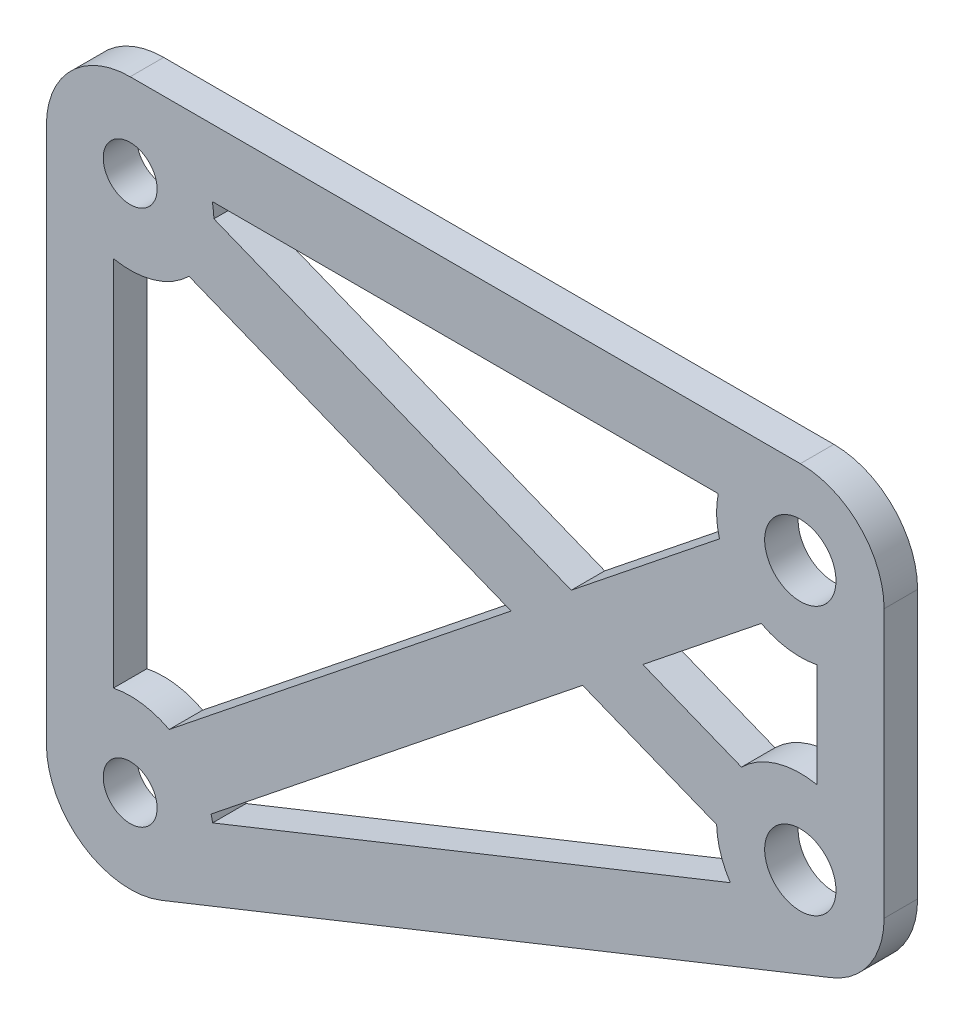
ISO-10303-21;
HEADER;
FILE_DESCRIPTION(('STEP AP214'),'2;1');
FILE_NAME('part.step','',(''),(''),'','','');
FILE_SCHEMA(('AUTOMOTIVE_DESIGN { 1 0 10303 214 1 1 1 1 }'));
ENDSEC;
DATA;
#1=APPLICATION_CONTEXT('core data for automotive mechanical design processes');
#2=APPLICATION_PROTOCOL_DEFINITION('international standard','automotive_design',2000,#1);
#3=PRODUCT_CONTEXT('',#1,'mechanical');
#4=PRODUCT('Part','Part','',(#3));
#5=PRODUCT_RELATED_PRODUCT_CATEGORY('part','',(#4));
#6=PRODUCT_DEFINITION_FORMATION('','',#4);
#7=PRODUCT_DEFINITION_CONTEXT('part definition',#1,'design');
#8=PRODUCT_DEFINITION('design','',#6,#7);
#9=PRODUCT_DEFINITION_SHAPE('','',#8);
#10=(LENGTH_UNIT() NAMED_UNIT(*) SI_UNIT(.MILLI.,.METRE.));
#11=(NAMED_UNIT(*) PLANE_ANGLE_UNIT() SI_UNIT($,.RADIAN.));
#12=(NAMED_UNIT(*) SI_UNIT($,.STERADIAN.) SOLID_ANGLE_UNIT());
#13=UNCERTAINTY_MEASURE_WITH_UNIT(LENGTH_MEASURE(1.E-05),#10,'distance_accuracy_value','');
#14=(GEOMETRIC_REPRESENTATION_CONTEXT(3) GLOBAL_UNCERTAINTY_ASSIGNED_CONTEXT((#13)) GLOBAL_UNIT_ASSIGNED_CONTEXT((#10,
#11,#12)) REPRESENTATION_CONTEXT('',''));
#15=CARTESIAN_POINT('',(0.,0.,0.));
#16=DIRECTION('',(0.,0.,1.));
#17=DIRECTION('',(1.,0.,0.));
#18=AXIS2_PLACEMENT_3D('',#15,#16,#17);
#19=CARTESIAN_POINT('',(63.5,50.8,3.175));
#20=DIRECTION('',(0.,0.,1.));
#21=DIRECTION('',(1.,0.,0.));
#22=AXIS2_PLACEMENT_3D('',#19,#20,#21);
#23=PLANE('',#22);
#24=CARTESIAN_POINT('',(0.,50.8,3.175));
#25=DIRECTION('',(0.,0.,1.));
#26=DIRECTION('',(1.,0.,0.));
#27=AXIS2_PLACEMENT_3D('',#24,#25,#26);
#28=CIRCLE('',#27,2.55269999999999);
#29=CARTESIAN_POINT('',(2.55269999999999,50.8,3.175));
#30=VERTEX_POINT('',#29);
#31=EDGE_CURVE('E462',#30,#30,#28,.T.);
#32=ORIENTED_EDGE('',*,*,#31,.F.);
#33=EDGE_LOOP('',(#32));
#34=FACE_BOUND('',#33,.T.);
#35=CARTESIAN_POINT('',(0.,0.,3.175));
#36=DIRECTION('',(0.,0.,1.));
#37=DIRECTION('',(1.,0.,0.));
#38=AXIS2_PLACEMENT_3D('',#35,#36,#37);
#39=CIRCLE('',#38,2.55269999999999);
#40=CARTESIAN_POINT('',(2.55269999999999,0.,3.175));
#41=VERTEX_POINT('',#40);
#42=EDGE_CURVE('E476',#41,#41,#39,.T.);
#43=ORIENTED_EDGE('',*,*,#42,.F.);
#44=EDGE_LOOP('',(#43));
#45=FACE_BOUND('',#44,.T.);
#46=CARTESIAN_POINT('',(63.5,50.8,3.175));
#47=DIRECTION('',(0.,0.,1.));
#48=DIRECTION('',(1.,0.,0.));
#49=AXIS2_PLACEMENT_3D('',#46,#47,#48);
#50=CIRCLE('',#49,3.3782);
#51=CARTESIAN_POINT('',(66.8782,50.8,3.175));
#52=VERTEX_POINT('',#51);
#53=EDGE_CURVE('E482',#52,#52,#50,.T.);
#54=ORIENTED_EDGE('',*,*,#53,.F.);
#55=EDGE_LOOP('',(#54));
#56=FACE_BOUND('',#55,.T.);
#57=CARTESIAN_POINT('',(63.5,25.4,3.175));
#58=DIRECTION('',(0.,0.,1.));
#59=DIRECTION('',(1.,0.,0.));
#60=AXIS2_PLACEMENT_3D('',#57,#58,#59);
#61=CIRCLE('',#60,3.3782);
#62=CARTESIAN_POINT('',(66.8782,25.4,3.175));
#63=VERTEX_POINT('',#62);
#64=EDGE_CURVE('E488',#63,#63,#61,.T.);
#65=ORIENTED_EDGE('',*,*,#64,.F.);
#66=EDGE_LOOP('',(#65));
#67=FACE_BOUND('',#66,.T.);
#68=CARTESIAN_POINT('',(63.5,50.8,3.175));
#69=DIRECTION('',(0.,0.,1.));
#70=DIRECTION('',(1.,0.,0.));
#71=AXIS2_PLACEMENT_3D('',#68,#69,#70);
#72=CIRCLE('',#71,7.9375);
#73=CARTESIAN_POINT('',(71.4375,50.8,3.175));
#74=VERTEX_POINT('',#73);
#75=CARTESIAN_POINT('',(63.5,58.7375,3.175));
#76=VERTEX_POINT('',#75);
#77=EDGE_CURVE('E495',#74,#76,#72,.T.);
#78=ORIENTED_EDGE('',*,*,#77,.T.);
#79=DIRECTION('',(-1.,0.,0.));
#80=VECTOR('',#79,1.);
#81=CARTESIAN_POINT('',(0.,58.7375,3.175));
#82=LINE('',#81,#80);
#83=CARTESIAN_POINT('',(0.,58.7375,3.175));
#84=VERTEX_POINT('',#83);
#85=EDGE_CURVE('E498',#76,#84,#82,.T.);
#86=ORIENTED_EDGE('',*,*,#85,.T.);
#87=CARTESIAN_POINT('',(0.,50.8,3.175));
#88=DIRECTION('',(0.,0.,1.));
#89=DIRECTION('',(1.,0.,0.));
#90=AXIS2_PLACEMENT_3D('',#87,#88,#89);
#91=CIRCLE('',#90,7.9375);
#92=CARTESIAN_POINT('',(-7.9375,50.8,3.175));
#93=VERTEX_POINT('',#92);
#94=EDGE_CURVE('E501',#84,#93,#91,.T.);
#95=ORIENTED_EDGE('',*,*,#94,.T.);
#96=DIRECTION('',(0.,-1.,0.));
#97=VECTOR('',#96,1.);
#98=CARTESIAN_POINT('',(-7.9375,0.,3.175));
#99=LINE('',#98,#97);
#100=CARTESIAN_POINT('',(-7.9375,0.,3.175));
#101=VERTEX_POINT('',#100);
#102=EDGE_CURVE('E503',#93,#101,#99,.T.);
#103=ORIENTED_EDGE('',*,*,#102,.T.);
#104=CARTESIAN_POINT('',(0.,0.,3.175));
#105=DIRECTION('',(0.,0.,1.));
#106=DIRECTION('',(1.,0.,0.));
#107=AXIS2_PLACEMENT_3D('',#104,#105,#106);
#108=CIRCLE('',#107,7.9375);
#109=CARTESIAN_POINT('',(2.9479134935607,-7.36978373390175,3.175));
#110=VERTEX_POINT('',#109);
#111=EDGE_CURVE('E505',#101,#110,#108,.T.);
#112=ORIENTED_EDGE('',*,*,#111,.T.);
#113=DIRECTION('',(0.928476690885259,0.371390676354104,0.));
#114=VECTOR('',#113,1.);
#115=CARTESIAN_POINT('',(66.4479134935607,18.0302162660983,3.175));
#116=LINE('',#115,#114);
#117=CARTESIAN_POINT('',(66.4479134935607,18.0302162660983,3.175));
#118=VERTEX_POINT('',#117);
#119=EDGE_CURVE('E507',#110,#118,#116,.T.);
#120=ORIENTED_EDGE('',*,*,#119,.T.);
#121=CARTESIAN_POINT('',(63.5,25.4,3.175));
#122=DIRECTION('',(0.,0.,1.));
#123=DIRECTION('',(1.,0.,0.));
#124=AXIS2_PLACEMENT_3D('',#121,#122,#123);
#125=CIRCLE('',#124,7.9375);
#126=CARTESIAN_POINT('',(71.4375,25.4,3.175));
#127=VERTEX_POINT('',#126);
#128=EDGE_CURVE('E509',#118,#127,#125,.T.);
#129=ORIENTED_EDGE('',*,*,#128,.T.);
#130=DIRECTION('',(0.,1.,0.));
#131=VECTOR('',#130,1.);
#132=CARTESIAN_POINT('',(71.4375,50.8,3.175));
#133=LINE('',#132,#131);
#134=EDGE_CURVE('E511',#127,#74,#133,.T.);
#135=ORIENTED_EDGE('',*,*,#134,.T.);
#136=EDGE_LOOP('',(#78,#86,#95,#103,#112,#120,#129,#135));
#137=FACE_BOUND('',#136,.T.);
#138=DIRECTION('',(-0.78086880944303,-0.624695047554424,0.));
#139=VECTOR('',#138,1.);
#140=CARTESIAN_POINT('',(-1.9834067759853,2.47925846998162,3.175));
#141=LINE('',#140,#139);
#142=CARTESIAN_POINT('',(36.0953637139164,32.942274861903,3.175));
#143=VERTEX_POINT('',#142);
#144=CARTESIAN_POINT('',(3.69728802704029,7.02381431240211,3.175));
#145=VERTEX_POINT('',#144);
#146=EDGE_CURVE('E449',#143,#145,#141,.T.);
#147=ORIENTED_EDGE('',*,*,#146,.T.);
#148=CARTESIAN_POINT('',(0.,0.,3.175));
#149=DIRECTION('',(0.,0.,1.));
#150=DIRECTION('',(1.,0.,0.));
#151=AXIS2_PLACEMENT_3D('',#148,#149,#150);
#152=CIRCLE('',#151,7.9375);
#153=CARTESIAN_POINT('',(-1.5875,7.77712993333659,3.175));
#154=VERTEX_POINT('',#153);
#155=EDGE_CURVE('E390',#145,#154,#152,.T.);
#156=ORIENTED_EDGE('',*,*,#155,.T.);
#157=DIRECTION('',(0.,-1.,0.));
#158=VECTOR('',#157,1.);
#159=CARTESIAN_POINT('',(-1.5875,0.,3.175));
#160=LINE('',#159,#158);
#161=CARTESIAN_POINT('',(-1.5875,43.0228700666634,3.175));
#162=VERTEX_POINT('',#161);
#163=EDGE_CURVE('E436',#162,#154,#160,.T.);
#164=ORIENTED_EDGE('',*,*,#163,.F.);
#165=CARTESIAN_POINT('',(0.,50.8,3.175));
#166=DIRECTION('',(0.,0.,1.));
#167=DIRECTION('',(1.,0.,0.));
#168=AXIS2_PLACEMENT_3D('',#165,#166,#167);
#169=CIRCLE('',#168,7.9375);
#170=CARTESIAN_POINT('',(5.57535296578753,45.1502791611546,3.175));
#171=VERTEX_POINT('',#170);
#172=EDGE_CURVE('E455',#162,#171,#169,.T.);
#173=ORIENTED_EDGE('',*,*,#172,.T.);
#174=DIRECTION('',(0.928476690885259,-0.371390676354104,0.));
#175=VECTOR('',#174,1.);
#176=CARTESIAN_POINT('',(16.3380759818861,40.8451899547152,3.175));
#177=LINE('',#176,#175);
#178=EDGE_CURVE('E452',#171,#143,#177,.T.);
#179=ORIENTED_EDGE('',*,*,#178,.T.);
#180=EDGE_LOOP('',(#147,#156,#164,#173,#179));
#181=FACE_BOUND('',#180,.T.);
#182=DIRECTION('',(0.,1.,0.));
#183=VECTOR('',#182,1.);
#184=CARTESIAN_POINT('',(65.0875,0.,3.175));
#185=LINE('',#184,#183);
#186=CARTESIAN_POINT('',(65.0875,33.1771299333366,3.175));
#187=VERTEX_POINT('',#186);
#188=CARTESIAN_POINT('',(65.0875,43.0228700666634,3.175));
#189=VERTEX_POINT('',#188);
#190=EDGE_CURVE('E346',#187,#189,#185,.T.);
#191=ORIENTED_EDGE('',*,*,#190,.F.);
#192=CARTESIAN_POINT('',(63.5,25.4,3.175));
#193=DIRECTION('',(0.,0.,1.));
#194=DIRECTION('',(1.,0.,0.));
#195=AXIS2_PLACEMENT_3D('',#192,#193,#194);
#196=CIRCLE('',#195,7.93749999999999);
#197=CARTESIAN_POINT('',(57.9246470342125,31.0497208388454,3.175));
#198=VERTEX_POINT('',#197);
#199=EDGE_CURVE('E315',#187,#198,#196,.T.);
#200=ORIENTED_EDGE('',*,*,#199,.T.);
#201=DIRECTION('',(0.928476690885259,-0.371390676354104,0.));
#202=VECTOR('',#201,1.);
#203=CARTESIAN_POINT('',(18.6964067767346,46.7410169418366,3.175));
#204=LINE('',#203,#202);
#205=CARTESIAN_POINT('',(48.5713029527502,34.7910584714303,3.175));
#206=VERTEX_POINT('',#205);
#207=EDGE_CURVE('E335',#206,#198,#204,.T.);
#208=ORIENTED_EDGE('',*,*,#207,.F.);
#209=DIRECTION('',(-0.78086880944303,-0.624695047554424,0.));
#210=VECTOR('',#209,1.);
#211=CARTESIAN_POINT('',(1.98340677598529,-2.47925846998161,3.175));
#212=LINE('',#211,#210);
#213=CARTESIAN_POINT('',(59.8027119729597,43.7761856875979,3.175));
#214=VERTEX_POINT('',#213);
#215=EDGE_CURVE('E338',#214,#206,#212,.T.);
#216=ORIENTED_EDGE('',*,*,#215,.F.);
#217=CARTESIAN_POINT('',(63.5,50.8,3.175));
#218=DIRECTION('',(0.,0.,1.));
#219=DIRECTION('',(1.,0.,0.));
#220=AXIS2_PLACEMENT_3D('',#217,#218,#219);
#221=CIRCLE('',#220,7.93749999999999);
#222=EDGE_CURVE('E349',#214,#189,#221,.T.);
#223=ORIENTED_EDGE('',*,*,#222,.T.);
#224=EDGE_LOOP('',(#191,#200,#208,#216,#223));
#225=FACE_BOUND('',#224,.T.);
#226=DIRECTION('',(-1.,0.,0.));
#227=VECTOR('',#226,1.);
#228=CARTESIAN_POINT('',(0.,52.3875,3.175));
#229=LINE('',#228,#227);
#230=CARTESIAN_POINT('',(55.7228700666634,52.3875,3.175));
#231=VERTEX_POINT('',#230);
#232=CARTESIAN_POINT('',(7.77712993333659,52.3875,3.175));
#233=VERTEX_POINT('',#232);
#234=EDGE_CURVE('E377',#231,#233,#229,.T.);
#235=ORIENTED_EDGE('',*,*,#234,.F.);
#236=CARTESIAN_POINT('',(63.5,50.8,3.175));
#237=DIRECTION('',(0.,0.,1.));
#238=DIRECTION('',(1.,0.,0.));
#239=AXIS2_PLACEMENT_3D('',#236,#237,#238);
#240=CIRCLE('',#239,7.93749999999999);
#241=CARTESIAN_POINT('',(55.8358984209891,48.7347026275612,3.175));
#242=VERTEX_POINT('',#241);
#243=EDGE_CURVE('E146',#231,#242,#240,.T.);
#244=ORIENTED_EDGE('',*,*,#243,.T.);
#245=DIRECTION('',(-0.78086880944303,-0.624695047554424,0.));
#246=VECTOR('',#245,1.);
#247=CARTESIAN_POINT('',(-1.9834067759853,2.47925846998162,3.175));
#248=LINE('',#247,#246);
#249=CARTESIAN_POINT('',(41.7946631348005,37.5017143986102,3.175));
#250=VERTEX_POINT('',#249);
#251=EDGE_CURVE('E364',#242,#250,#248,.T.);
#252=ORIENTED_EDGE('',*,*,#251,.T.);
#253=DIRECTION('',(0.928476690885259,-0.371390676354104,0.));
#254=VECTOR('',#253,1.);
#255=CARTESIAN_POINT('',(18.6964067767346,46.7410169418366,3.175));
#256=LINE('',#255,#254);
#257=CARTESIAN_POINT('',(7.93368376063609,51.046106148276,3.175));
#258=VERTEX_POINT('',#257);
#259=EDGE_CURVE('E383',#258,#250,#256,.T.);
#260=ORIENTED_EDGE('',*,*,#259,.F.);
#261=CARTESIAN_POINT('',(0.,50.8,3.175));
#262=DIRECTION('',(0.,0.,1.));
#263=DIRECTION('',(1.,0.,0.));
#264=AXIS2_PLACEMENT_3D('',#261,#262,#263);
#265=CIRCLE('',#264,7.9375);
#266=EDGE_CURVE('E380',#258,#233,#265,.T.);
#267=ORIENTED_EDGE('',*,*,#266,.T.);
#268=EDGE_LOOP('',(#235,#244,#252,#260,#267));
#269=FACE_BOUND('',#268,.T.);
#270=DIRECTION('',(0.928476690885259,0.371390676354104,0.));
#271=VECTOR('',#270,1.);
#272=CARTESIAN_POINT('',(0.589582698712141,-1.47395674678035,3.175));
#273=LINE('',#272,#271);
#274=CARTESIAN_POINT('',(7.8104665638012,1.41439679925528,3.175));
#275=VERTEX_POINT('',#274);
#276=CARTESIAN_POINT('',(56.8686988336231,21.037689707184,3.175));
#277=VERTEX_POINT('',#276);
#278=EDGE_CURVE('E414',#275,#277,#273,.T.);
#279=ORIENTED_EDGE('',*,*,#278,.F.);
#280=CARTESIAN_POINT('',(0.,0.,3.175));
#281=DIRECTION('',(0.,0.,1.));
#282=DIRECTION('',(1.,0.,0.));
#283=AXIS2_PLACEMENT_3D('',#280,#281,#282);
#284=CIRCLE('',#283,7.9375);
#285=CARTESIAN_POINT('',(7.66410157901089,2.06529737243886,3.175));
#286=VERTEX_POINT('',#285);
#287=EDGE_CURVE('E138',#275,#286,#284,.T.);
#288=ORIENTED_EDGE('',*,*,#287,.T.);
#289=DIRECTION('',(-0.78086880944303,-0.624695047554424,0.));
#290=VECTOR('',#289,1.);
#291=CARTESIAN_POINT('',(1.98340677598529,-2.47925846998161,3.175));
#292=LINE('',#291,#290);
#293=CARTESIAN_POINT('',(42.8720035318662,30.2316189347231,3.175));
#294=VERTEX_POINT('',#293);
#295=EDGE_CURVE('E401',#294,#286,#292,.T.);
#296=ORIENTED_EDGE('',*,*,#295,.F.);
#297=DIRECTION('',(0.928476690885259,-0.371390676354104,0.));
#298=VECTOR('',#297,1.);
#299=CARTESIAN_POINT('',(16.3380759818861,40.8451899547152,3.175));
#300=LINE('',#299,#298);
#301=CARTESIAN_POINT('',(55.5663162393639,25.153893851724,3.175));
#302=VERTEX_POINT('',#301);
#303=EDGE_CURVE('E420',#294,#302,#300,.T.);
#304=ORIENTED_EDGE('',*,*,#303,.T.);
#305=CARTESIAN_POINT('',(63.5,25.4,3.175));
#306=DIRECTION('',(0.,0.,1.));
#307=DIRECTION('',(1.,0.,0.));
#308=AXIS2_PLACEMENT_3D('',#305,#306,#307);
#309=CIRCLE('',#308,7.93749999999999);
#310=EDGE_CURVE('E417',#302,#277,#309,.T.);
#311=ORIENTED_EDGE('',*,*,#310,.T.);
#312=EDGE_LOOP('',(#279,#288,#296,#304,#311));
#313=FACE_BOUND('',#312,.T.);
#314=ADVANCED_FACE('F123',(#34,#45,#56,#67,#137,#181,#225,#269,#313),#23,.T.);
#315=CARTESIAN_POINT('',(63.5,50.8,0.));
#316=DIRECTION('',(0.,0.,1.));
#317=DIRECTION('',(1.,0.,0.));
#318=AXIS2_PLACEMENT_3D('',#315,#316,#317);
#319=PLANE('',#318);
#320=CARTESIAN_POINT('',(63.5,50.8,0.));
#321=DIRECTION('',(0.,0.,1.));
#322=DIRECTION('',(1.,0.,0.));
#323=AXIS2_PLACEMENT_3D('',#320,#321,#322);
#324=CIRCLE('',#323,7.93749999999999);
#325=CARTESIAN_POINT('',(55.7228700666634,52.3875,0.));
#326=VERTEX_POINT('',#325);
#327=CARTESIAN_POINT('',(55.8358984209891,48.7347026275612,0.));
#328=VERTEX_POINT('',#327);
#329=EDGE_CURVE('E361',#326,#328,#324,.T.);
#330=ORIENTED_EDGE('',*,*,#329,.F.);
#331=DIRECTION('',(-1.,0.,0.));
#332=VECTOR('',#331,1.);
#333=CARTESIAN_POINT('',(0.,52.3875,0.));
#334=LINE('',#333,#332);
#335=CARTESIAN_POINT('',(7.77712993333659,52.3875,0.));
#336=VERTEX_POINT('',#335);
#337=EDGE_CURVE('E363',#326,#336,#334,.T.);
#338=ORIENTED_EDGE('',*,*,#337,.T.);
#339=CARTESIAN_POINT('',(0.,50.8,0.));
#340=DIRECTION('',(0.,0.,1.));
#341=DIRECTION('',(1.,0.,0.));
#342=AXIS2_PLACEMENT_3D('',#339,#340,#341);
#343=CIRCLE('',#342,7.9375);
#344=CARTESIAN_POINT('',(7.93368376063609,51.046106148276,0.));
#345=VERTEX_POINT('',#344);
#346=EDGE_CURVE('E367',#345,#336,#343,.T.);
#347=ORIENTED_EDGE('',*,*,#346,.F.);
#348=DIRECTION('',(0.928476690885259,-0.371390676354104,0.));
#349=VECTOR('',#348,1.);
#350=CARTESIAN_POINT('',(18.6964067767346,46.7410169418366,0.));
#351=LINE('',#350,#349);
#352=CARTESIAN_POINT('',(41.7946631348005,37.5017143986102,0.));
#353=VERTEX_POINT('',#352);
#354=EDGE_CURVE('E370',#345,#353,#351,.T.);
#355=ORIENTED_EDGE('',*,*,#354,.T.);
#356=DIRECTION('',(-0.78086880944303,-0.624695047554424,0.));
#357=VECTOR('',#356,1.);
#358=CARTESIAN_POINT('',(-1.9834067759853,2.47925846998162,0.));
#359=LINE('',#358,#357);
#360=EDGE_CURVE('E373',#328,#353,#359,.T.);
#361=ORIENTED_EDGE('',*,*,#360,.F.);
#362=EDGE_LOOP('',(#330,#338,#347,#355,#361));
#363=FACE_BOUND('',#362,.T.);
#364=CARTESIAN_POINT('',(0.,0.,0.));
#365=DIRECTION('',(0.,0.,1.));
#366=DIRECTION('',(1.,0.,0.));
#367=AXIS2_PLACEMENT_3D('',#364,#365,#366);
#368=CIRCLE('',#367,7.9375);
#369=CARTESIAN_POINT('',(3.69728802704029,7.0238143124021,0.));
#370=VERTEX_POINT('',#369);
#371=CARTESIAN_POINT('',(-1.5875,7.77712993333659,0.));
#372=VERTEX_POINT('',#371);
#373=EDGE_CURVE('E433',#370,#372,#368,.T.);
#374=ORIENTED_EDGE('',*,*,#373,.F.);
#375=DIRECTION('',(-0.78086880944303,-0.624695047554424,0.));
#376=VECTOR('',#375,1.);
#377=CARTESIAN_POINT('',(-1.9834067759853,2.47925846998162,0.));
#378=LINE('',#377,#376);
#379=CARTESIAN_POINT('',(36.0953637139164,32.942274861903,0.));
#380=VERTEX_POINT('',#379);
#381=EDGE_CURVE('E435',#380,#370,#378,.T.);
#382=ORIENTED_EDGE('',*,*,#381,.F.);
#383=DIRECTION('',(0.928476690885259,-0.371390676354104,0.));
#384=VECTOR('',#383,1.);
#385=CARTESIAN_POINT('',(16.3380759818861,40.8451899547152,0.));
#386=LINE('',#385,#384);
#387=CARTESIAN_POINT('',(5.57535296578753,45.1502791611546,0.));
#388=VERTEX_POINT('',#387);
#389=EDGE_CURVE('E438',#388,#380,#386,.T.);
#390=ORIENTED_EDGE('',*,*,#389,.F.);
#391=CARTESIAN_POINT('',(0.,50.8,0.));
#392=DIRECTION('',(0.,0.,1.));
#393=DIRECTION('',(1.,0.,0.));
#394=AXIS2_PLACEMENT_3D('',#391,#392,#393);
#395=CIRCLE('',#394,7.9375);
#396=CARTESIAN_POINT('',(-1.5875,43.0228700666634,0.));
#397=VERTEX_POINT('',#396);
#398=EDGE_CURVE('E441',#397,#388,#395,.T.);
#399=ORIENTED_EDGE('',*,*,#398,.F.);
#400=DIRECTION('',(0.,-1.,0.));
#401=VECTOR('',#400,1.);
#402=CARTESIAN_POINT('',(-1.5875,0.,0.));
#403=LINE('',#402,#401);
#404=EDGE_CURVE('E443',#397,#372,#403,.T.);
#405=ORIENTED_EDGE('',*,*,#404,.T.);
#406=EDGE_LOOP('',(#374,#382,#390,#399,#405));
#407=FACE_BOUND('',#406,.T.);
#408=CARTESIAN_POINT('',(0.,50.8,0.));
#409=DIRECTION('',(0.,0.,1.));
#410=DIRECTION('',(1.,0.,0.));
#411=AXIS2_PLACEMENT_3D('',#408,#409,#410);
#412=CIRCLE('',#411,2.55269999999999);
#413=CARTESIAN_POINT('',(2.55269999999999,50.8,0.));
#414=VERTEX_POINT('',#413);
#415=EDGE_CURVE('E473',#414,#414,#412,.T.);
#416=ORIENTED_EDGE('',*,*,#415,.T.);
#417=EDGE_LOOP('',(#416));
#418=FACE_BOUND('',#417,.T.);
#419=CARTESIAN_POINT('',(0.,0.,0.));
#420=DIRECTION('',(0.,0.,1.));
#421=DIRECTION('',(1.,0.,0.));
#422=AXIS2_PLACEMENT_3D('',#419,#420,#421);
#423=CIRCLE('',#422,2.55269999999999);
#424=CARTESIAN_POINT('',(2.55269999999999,0.,0.));
#425=VERTEX_POINT('',#424);
#426=EDGE_CURVE('E479',#425,#425,#423,.T.);
#427=ORIENTED_EDGE('',*,*,#426,.T.);
#428=EDGE_LOOP('',(#427));
#429=FACE_BOUND('',#428,.T.);
#430=CARTESIAN_POINT('',(63.5,50.8,0.));
#431=DIRECTION('',(0.,0.,1.));
#432=DIRECTION('',(1.,0.,0.));
#433=AXIS2_PLACEMENT_3D('',#430,#431,#432);
#434=CIRCLE('',#433,3.3782);
#435=CARTESIAN_POINT('',(66.8782,50.8,0.));
#436=VERTEX_POINT('',#435);
#437=EDGE_CURVE('E485',#436,#436,#434,.T.);
#438=ORIENTED_EDGE('',*,*,#437,.T.);
#439=EDGE_LOOP('',(#438));
#440=FACE_BOUND('',#439,.T.);
#441=CARTESIAN_POINT('',(63.5,25.4,0.));
#442=DIRECTION('',(0.,0.,1.));
#443=DIRECTION('',(1.,0.,0.));
#444=AXIS2_PLACEMENT_3D('',#441,#442,#443);
#445=CIRCLE('',#444,3.3782);
#446=CARTESIAN_POINT('',(66.8782,25.4,0.));
#447=VERTEX_POINT('',#446);
#448=EDGE_CURVE('E491',#447,#447,#445,.T.);
#449=ORIENTED_EDGE('',*,*,#448,.T.);
#450=EDGE_LOOP('',(#449));
#451=FACE_BOUND('',#450,.T.);
#452=CARTESIAN_POINT('',(63.5,50.8,0.));
#453=DIRECTION('',(0.,0.,1.));
#454=DIRECTION('',(1.,0.,0.));
#455=AXIS2_PLACEMENT_3D('',#452,#453,#454);
#456=CIRCLE('',#455,7.9375);
#457=CARTESIAN_POINT('',(71.4375,50.8,0.));
#458=VERTEX_POINT('',#457);
#459=CARTESIAN_POINT('',(63.5,58.7375,0.));
#460=VERTEX_POINT('',#459);
#461=EDGE_CURVE('E494',#458,#460,#456,.T.);
#462=ORIENTED_EDGE('',*,*,#461,.F.);
#463=DIRECTION('',(0.,1.,0.));
#464=VECTOR('',#463,1.);
#465=CARTESIAN_POINT('',(71.4375,50.8,0.));
#466=LINE('',#465,#464);
#467=CARTESIAN_POINT('',(71.4375,25.4,0.));
#468=VERTEX_POINT('',#467);
#469=EDGE_CURVE('E499',#468,#458,#466,.T.);
#470=ORIENTED_EDGE('',*,*,#469,.F.);
#471=CARTESIAN_POINT('',(63.5,25.4,0.));
#472=DIRECTION('',(0.,0.,1.));
#473=DIRECTION('',(1.,0.,0.));
#474=AXIS2_PLACEMENT_3D('',#471,#472,#473);
#475=CIRCLE('',#474,7.9375);
#476=CARTESIAN_POINT('',(66.4479134935607,18.0302162660983,0.));
#477=VERTEX_POINT('',#476);
#478=EDGE_CURVE('E526',#477,#468,#475,.T.);
#479=ORIENTED_EDGE('',*,*,#478,.F.);
#480=DIRECTION('',(0.928476690885259,0.371390676354104,0.));
#481=VECTOR('',#480,1.);
#482=CARTESIAN_POINT('',(66.4479134935607,18.0302162660983,0.));
#483=LINE('',#482,#481);
#484=CARTESIAN_POINT('',(2.9479134935607,-7.36978373390175,0.));
#485=VERTEX_POINT('',#484);
#486=EDGE_CURVE('E524',#485,#477,#483,.T.);
#487=ORIENTED_EDGE('',*,*,#486,.F.);
#488=CARTESIAN_POINT('',(0.,0.,0.));
#489=DIRECTION('',(0.,0.,1.));
#490=DIRECTION('',(1.,0.,0.));
#491=AXIS2_PLACEMENT_3D('',#488,#489,#490);
#492=CIRCLE('',#491,7.9375);
#493=CARTESIAN_POINT('',(-7.9375,0.,0.));
#494=VERTEX_POINT('',#493);
#495=EDGE_CURVE('E522',#494,#485,#492,.T.);
#496=ORIENTED_EDGE('',*,*,#495,.F.);
#497=DIRECTION('',(0.,-1.,0.));
#498=VECTOR('',#497,1.);
#499=CARTESIAN_POINT('',(-7.9375,0.,0.));
#500=LINE('',#499,#498);
#501=CARTESIAN_POINT('',(-7.9375,50.8,0.));
#502=VERTEX_POINT('',#501);
#503=EDGE_CURVE('E520',#502,#494,#500,.T.);
#504=ORIENTED_EDGE('',*,*,#503,.F.);
#505=CARTESIAN_POINT('',(0.,50.8,0.));
#506=DIRECTION('',(0.,0.,1.));
#507=DIRECTION('',(1.,0.,0.));
#508=AXIS2_PLACEMENT_3D('',#505,#506,#507);
#509=CIRCLE('',#508,7.9375);
#510=CARTESIAN_POINT('',(0.,58.7375,0.));
#511=VERTEX_POINT('',#510);
#512=EDGE_CURVE('E518',#511,#502,#509,.T.);
#513=ORIENTED_EDGE('',*,*,#512,.F.);
#514=DIRECTION('',(-1.,0.,0.));
#515=VECTOR('',#514,1.);
#516=CARTESIAN_POINT('',(0.,58.7375,0.));
#517=LINE('',#516,#515);
#518=EDGE_CURVE('E516',#460,#511,#517,.T.);
#519=ORIENTED_EDGE('',*,*,#518,.F.);
#520=EDGE_LOOP('',(#462,#470,#479,#487,#496,#504,#513,#519));
#521=FACE_BOUND('',#520,.T.);
#522=CARTESIAN_POINT('',(63.5,25.4,0.));
#523=DIRECTION('',(0.,0.,1.));
#524=DIRECTION('',(1.,0.,0.));
#525=AXIS2_PLACEMENT_3D('',#522,#523,#524);
#526=CIRCLE('',#525,7.93749999999999);
#527=CARTESIAN_POINT('',(65.0875,33.1771299333366,0.));
#528=VERTEX_POINT('',#527);
#529=CARTESIAN_POINT('',(57.9246470342125,31.0497208388454,0.));
#530=VERTEX_POINT('',#529);
#531=EDGE_CURVE('E312',#528,#530,#526,.T.);
#532=ORIENTED_EDGE('',*,*,#531,.F.);
#533=DIRECTION('',(0.,1.,0.));
#534=VECTOR('',#533,1.);
#535=CARTESIAN_POINT('',(65.0875,0.,0.));
#536=LINE('',#535,#534);
#537=CARTESIAN_POINT('',(65.0875,43.0228700666634,0.));
#538=VERTEX_POINT('',#537);
#539=EDGE_CURVE('E323',#528,#538,#536,.T.);
#540=ORIENTED_EDGE('',*,*,#539,.T.);
#541=CARTESIAN_POINT('',(63.5,50.8,0.));
#542=DIRECTION('',(0.,0.,1.));
#543=DIRECTION('',(1.,0.,0.));
#544=AXIS2_PLACEMENT_3D('',#541,#542,#543);
#545=CIRCLE('',#544,7.93749999999999);
#546=CARTESIAN_POINT('',(59.8027119729597,43.7761856875979,0.));
#547=VERTEX_POINT('',#546);
#548=EDGE_CURVE('E328',#547,#538,#545,.T.);
#549=ORIENTED_EDGE('',*,*,#548,.F.);
#550=DIRECTION('',(-0.78086880944303,-0.624695047554424,0.));
#551=VECTOR('',#550,1.);
#552=CARTESIAN_POINT('',(1.98340677598529,-2.47925846998161,0.));
#553=LINE('',#552,#551);
#554=CARTESIAN_POINT('',(48.5713029527502,34.7910584714303,0.));
#555=VERTEX_POINT('',#554);
#556=EDGE_CURVE('E342',#547,#555,#553,.T.);
#557=ORIENTED_EDGE('',*,*,#556,.T.);
#558=DIRECTION('',(0.928476690885259,-0.371390676354104,0.));
#559=VECTOR('',#558,1.);
#560=CARTESIAN_POINT('',(18.6964067767346,46.7410169418366,0.));
#561=LINE('',#560,#559);
#562=EDGE_CURVE('E320',#555,#530,#561,.T.);
#563=ORIENTED_EDGE('',*,*,#562,.T.);
#564=EDGE_LOOP('',(#532,#540,#549,#557,#563));
#565=FACE_BOUND('',#564,.T.);
#566=CARTESIAN_POINT('',(0.,0.,0.));
#567=DIRECTION('',(0.,0.,1.));
#568=DIRECTION('',(1.,0.,0.));
#569=AXIS2_PLACEMENT_3D('',#566,#567,#568);
#570=CIRCLE('',#569,7.9375);
#571=CARTESIAN_POINT('',(7.8104665638012,1.41439679925527,0.));
#572=VERTEX_POINT('',#571);
#573=CARTESIAN_POINT('',(7.66410157901089,2.06529737243886,0.));
#574=VERTEX_POINT('',#573);
#575=EDGE_CURVE('E398',#572,#574,#570,.T.);
#576=ORIENTED_EDGE('',*,*,#575,.F.);
#577=DIRECTION('',(0.928476690885259,0.371390676354104,0.));
#578=VECTOR('',#577,1.);
#579=CARTESIAN_POINT('',(0.589582698712141,-1.47395674678035,0.));
#580=LINE('',#579,#578);
#581=CARTESIAN_POINT('',(56.8686988336231,21.037689707184,0.));
#582=VERTEX_POINT('',#581);
#583=EDGE_CURVE('E400',#572,#582,#580,.T.);
#584=ORIENTED_EDGE('',*,*,#583,.T.);
#585=CARTESIAN_POINT('',(63.5,25.4,0.));
#586=DIRECTION('',(0.,0.,1.));
#587=DIRECTION('',(1.,0.,0.));
#588=AXIS2_PLACEMENT_3D('',#585,#586,#587);
#589=CIRCLE('',#588,7.93749999999999);
#590=CARTESIAN_POINT('',(55.5663162393639,25.153893851724,0.));
#591=VERTEX_POINT('',#590);
#592=EDGE_CURVE('E404',#591,#582,#589,.T.);
#593=ORIENTED_EDGE('',*,*,#592,.F.);
#594=DIRECTION('',(0.928476690885259,-0.371390676354104,0.));
#595=VECTOR('',#594,1.);
#596=CARTESIAN_POINT('',(16.3380759818861,40.8451899547152,0.));
#597=LINE('',#596,#595);
#598=CARTESIAN_POINT('',(42.8720035318662,30.2316189347231,0.));
#599=VERTEX_POINT('',#598);
#600=EDGE_CURVE('E407',#599,#591,#597,.T.);
#601=ORIENTED_EDGE('',*,*,#600,.F.);
#602=DIRECTION('',(-0.78086880944303,-0.624695047554424,0.));
#603=VECTOR('',#602,1.);
#604=CARTESIAN_POINT('',(1.98340677598529,-2.47925846998161,0.));
#605=LINE('',#604,#603);
#606=EDGE_CURVE('E409',#599,#574,#605,.T.);
#607=ORIENTED_EDGE('',*,*,#606,.T.);
#608=EDGE_LOOP('',(#576,#584,#593,#601,#607));
#609=FACE_BOUND('',#608,.T.);
#610=ADVANCED_FACE('F331',(#363,#407,#418,#429,#440,#451,#521,#565,#609),#319,.F.);
#611=CARTESIAN_POINT('',(63.5,50.8,3.175));
#612=DIRECTION('',(0.,0.,-1.));
#613=DIRECTION('',(-1.,0.,0.));
#614=AXIS2_PLACEMENT_3D('',#611,#612,#613);
#615=CYLINDRICAL_SURFACE('',#614,7.9375);
#616=ORIENTED_EDGE('',*,*,#461,.T.);
#617=DIRECTION('',(0.,0.,-1.));
#618=VECTOR('',#617,1.);
#619=CARTESIAN_POINT('',(63.5,58.7375,3.175));
#620=LINE('',#619,#618);
#621=EDGE_CURVE('E12',#76,#460,#620,.T.);
#622=ORIENTED_EDGE('',*,*,#621,.F.);
#623=ORIENTED_EDGE('',*,*,#77,.F.);
#624=DIRECTION('',(0.,0.,-1.));
#625=VECTOR('',#624,1.);
#626=CARTESIAN_POINT('',(71.4375,50.8,3.175));
#627=LINE('',#626,#625);
#628=EDGE_CURVE('E513',#74,#458,#627,.T.);
#629=ORIENTED_EDGE('',*,*,#628,.T.);
#630=EDGE_LOOP('',(#616,#622,#623,#629));
#631=FACE_BOUND('',#630,.T.);
#632=ADVANCED_FACE('F125',(#631),#615,.T.);
#633=CARTESIAN_POINT('',(0.,58.7375,3.175));
#634=DIRECTION('',(0.,-1.,0.));
#635=DIRECTION('',(0.,0.,-1.));
#636=AXIS2_PLACEMENT_3D('',#633,#634,#635);
#637=PLANE('',#636);
#638=ORIENTED_EDGE('',*,*,#518,.T.);
#639=DIRECTION('',(0.,0.,-1.));
#640=VECTOR('',#639,1.);
#641=CARTESIAN_POINT('',(0.,58.7375,3.175));
#642=LINE('',#641,#640);
#643=EDGE_CURVE('E131',#84,#511,#642,.T.);
#644=ORIENTED_EDGE('',*,*,#643,.F.);
#645=ORIENTED_EDGE('',*,*,#85,.F.);
#646=ORIENTED_EDGE('',*,*,#621,.T.);
#647=EDGE_LOOP('',(#638,#644,#645,#646));
#648=FACE_BOUND('',#647,.T.);
#649=ADVANCED_FACE('F572',(#648),#637,.F.);
#650=CARTESIAN_POINT('',(0.,50.8,3.175));
#651=DIRECTION('',(0.,0.,-1.));
#652=DIRECTION('',(-1.,0.,0.));
#653=AXIS2_PLACEMENT_3D('',#650,#651,#652);
#654=CYLINDRICAL_SURFACE('',#653,7.9375);
#655=ORIENTED_EDGE('',*,*,#512,.T.);
#656=DIRECTION('',(0.,0.,-1.));
#657=VECTOR('',#656,1.);
#658=CARTESIAN_POINT('',(-7.9375,50.8,3.175));
#659=LINE('',#658,#657);
#660=EDGE_CURVE('E543',#93,#502,#659,.T.);
#661=ORIENTED_EDGE('',*,*,#660,.F.);
#662=ORIENTED_EDGE('',*,*,#94,.F.);
#663=ORIENTED_EDGE('',*,*,#643,.T.);
#664=EDGE_LOOP('',(#655,#661,#662,#663));
#665=FACE_BOUND('',#664,.T.);
#666=ADVANCED_FACE('F550',(#665),#654,.T.);
#667=CARTESIAN_POINT('',(-7.9375,0.,3.175));
#668=DIRECTION('',(1.,0.,0.));
#669=DIRECTION('',(0.,0.,-1.));
#670=AXIS2_PLACEMENT_3D('',#667,#668,#669);
#671=PLANE('',#670);
#672=ORIENTED_EDGE('',*,*,#503,.T.);
#673=DIRECTION('',(0.,0.,-1.));
#674=VECTOR('',#673,1.);
#675=CARTESIAN_POINT('',(-7.9375,0.,3.175));
#676=LINE('',#675,#674);
#677=EDGE_CURVE('E540',#101,#494,#676,.T.);
#678=ORIENTED_EDGE('',*,*,#677,.F.);
#679=ORIENTED_EDGE('',*,*,#102,.F.);
#680=ORIENTED_EDGE('',*,*,#660,.T.);
#681=EDGE_LOOP('',(#672,#678,#679,#680));
#682=FACE_BOUND('',#681,.T.);
#683=ADVANCED_FACE('F560',(#682),#671,.F.);
#684=CARTESIAN_POINT('',(0.,0.,3.175));
#685=DIRECTION('',(0.,0.,-1.));
#686=DIRECTION('',(-1.,0.,0.));
#687=AXIS2_PLACEMENT_3D('',#684,#685,#686);
#688=CYLINDRICAL_SURFACE('',#687,7.9375);
#689=ORIENTED_EDGE('',*,*,#495,.T.);
#690=DIRECTION('',(0.,0.,-1.));
#691=VECTOR('',#690,1.);
#692=CARTESIAN_POINT('',(2.9479134935607,-7.36978373390175,3.175));
#693=LINE('',#692,#691);
#694=EDGE_CURVE('E537',#110,#485,#693,.T.);
#695=ORIENTED_EDGE('',*,*,#694,.F.);
#696=ORIENTED_EDGE('',*,*,#111,.F.);
#697=ORIENTED_EDGE('',*,*,#677,.T.);
#698=EDGE_LOOP('',(#689,#695,#696,#697));
#699=FACE_BOUND('',#698,.T.);
#700=ADVANCED_FACE('F564',(#699),#688,.T.);
#701=CARTESIAN_POINT('',(66.4479134935607,18.0302162660983,3.175));
#702=DIRECTION('',(-0.371390676354104,0.928476690885259,0.));
#703=DIRECTION('',(-0.928476690885259,-0.371390676354104,0.));
#704=AXIS2_PLACEMENT_3D('',#701,#702,#703);
#705=PLANE('',#704);
#706=ORIENTED_EDGE('',*,*,#486,.T.);
#707=DIRECTION('',(0.,0.,-1.));
#708=VECTOR('',#707,1.);
#709=CARTESIAN_POINT('',(66.4479134935607,18.0302162660983,3.175));
#710=LINE('',#709,#708);
#711=EDGE_CURVE('E534',#118,#477,#710,.T.);
#712=ORIENTED_EDGE('',*,*,#711,.F.);
#713=ORIENTED_EDGE('',*,*,#119,.F.);
#714=ORIENTED_EDGE('',*,*,#694,.T.);
#715=EDGE_LOOP('',(#706,#712,#713,#714));
#716=FACE_BOUND('',#715,.T.);
#717=ADVANCED_FACE('F585',(#716),#705,.F.);
#718=CARTESIAN_POINT('',(63.5,25.4,3.175));
#719=DIRECTION('',(0.,0.,-1.));
#720=DIRECTION('',(-1.,0.,0.));
#721=AXIS2_PLACEMENT_3D('',#718,#719,#720);
#722=CYLINDRICAL_SURFACE('',#721,7.9375);
#723=ORIENTED_EDGE('',*,*,#478,.T.);
#724=DIRECTION('',(0.,0.,-1.));
#725=VECTOR('',#724,1.);
#726=CARTESIAN_POINT('',(71.4375,25.4,3.175));
#727=LINE('',#726,#725);
#728=EDGE_CURVE('E531',#127,#468,#727,.T.);
#729=ORIENTED_EDGE('',*,*,#728,.F.);
#730=ORIENTED_EDGE('',*,*,#128,.F.);
#731=ORIENTED_EDGE('',*,*,#711,.T.);
#732=EDGE_LOOP('',(#723,#729,#730,#731));
#733=FACE_BOUND('',#732,.T.);
#734=ADVANCED_FACE('F583',(#733),#722,.T.);
#735=CARTESIAN_POINT('',(71.4375,50.8,3.175));
#736=DIRECTION('',(-1.,0.,0.));
#737=DIRECTION('',(0.,0.,1.));
#738=AXIS2_PLACEMENT_3D('',#735,#736,#737);
#739=PLANE('',#738);
#740=ORIENTED_EDGE('',*,*,#469,.T.);
#741=ORIENTED_EDGE('',*,*,#628,.F.);
#742=ORIENTED_EDGE('',*,*,#134,.F.);
#743=ORIENTED_EDGE('',*,*,#728,.T.);
#744=EDGE_LOOP('',(#740,#741,#742,#743));
#745=FACE_BOUND('',#744,.T.);
#746=ADVANCED_FACE('F578',(#745),#739,.F.);
#747=CARTESIAN_POINT('',(63.5,25.4,3.175));
#748=DIRECTION('',(0.,0.,1.));
#749=DIRECTION('',(1.,0.,0.));
#750=AXIS2_PLACEMENT_3D('',#747,#748,#749);
#751=CYLINDRICAL_SURFACE('',#750,3.3782);
#752=ORIENTED_EDGE('',*,*,#448,.F.);
#753=EDGE_LOOP('',(#752));
#754=FACE_BOUND('',#753,.T.);
#755=ORIENTED_EDGE('',*,*,#64,.T.);
#756=EDGE_LOOP('',(#755));
#757=FACE_BOUND('',#756,.T.);
#758=ADVANCED_FACE('F605',(#754,#757),#751,.F.);
#759=CARTESIAN_POINT('',(63.5,50.8,3.175));
#760=DIRECTION('',(0.,0.,1.));
#761=DIRECTION('',(1.,0.,0.));
#762=AXIS2_PLACEMENT_3D('',#759,#760,#761);
#763=CYLINDRICAL_SURFACE('',#762,3.3782);
#764=ORIENTED_EDGE('',*,*,#437,.F.);
#765=EDGE_LOOP('',(#764));
#766=FACE_BOUND('',#765,.T.);
#767=ORIENTED_EDGE('',*,*,#53,.T.);
#768=EDGE_LOOP('',(#767));
#769=FACE_BOUND('',#768,.T.);
#770=ADVANCED_FACE('F612',(#766,#769),#763,.F.);
#771=CARTESIAN_POINT('',(0.,0.,3.175));
#772=DIRECTION('',(0.,0.,1.));
#773=DIRECTION('',(1.,0.,0.));
#774=AXIS2_PLACEMENT_3D('',#771,#772,#773);
#775=CYLINDRICAL_SURFACE('',#774,2.55269999999999);
#776=ORIENTED_EDGE('',*,*,#426,.F.);
#777=EDGE_LOOP('',(#776));
#778=FACE_BOUND('',#777,.T.);
#779=ORIENTED_EDGE('',*,*,#42,.T.);
#780=EDGE_LOOP('',(#779));
#781=FACE_BOUND('',#780,.T.);
#782=ADVANCED_FACE('F617',(#778,#781),#775,.F.);
#783=CARTESIAN_POINT('',(0.,50.8,3.175));
#784=DIRECTION('',(0.,0.,1.));
#785=DIRECTION('',(1.,0.,0.));
#786=AXIS2_PLACEMENT_3D('',#783,#784,#785);
#787=CYLINDRICAL_SURFACE('',#786,2.55269999999999);
#788=ORIENTED_EDGE('',*,*,#415,.F.);
#789=EDGE_LOOP('',(#788));
#790=FACE_BOUND('',#789,.T.);
#791=ORIENTED_EDGE('',*,*,#31,.T.);
#792=EDGE_LOOP('',(#791));
#793=FACE_BOUND('',#792,.T.);
#794=ADVANCED_FACE('F627',(#790,#793),#787,.F.);
#795=CARTESIAN_POINT('',(0.,0.,0.));
#796=DIRECTION('',(0.,0.,1.));
#797=DIRECTION('',(1.,0.,0.));
#798=AXIS2_PLACEMENT_3D('',#795,#796,#797);
#799=CYLINDRICAL_SURFACE('',#798,7.9375);
#800=ORIENTED_EDGE('',*,*,#155,.F.);
#801=DIRECTION('',(0.,0.,1.));
#802=VECTOR('',#801,1.);
#803=CARTESIAN_POINT('',(3.69728802704029,7.0238143124021,0.));
#804=LINE('',#803,#802);
#805=EDGE_CURVE('E446',#370,#145,#804,.T.);
#806=ORIENTED_EDGE('',*,*,#805,.F.);
#807=ORIENTED_EDGE('',*,*,#373,.T.);
#808=DIRECTION('',(0.,0.,1.));
#809=VECTOR('',#808,1.);
#810=CARTESIAN_POINT('',(-1.5875,7.77712993333659,0.));
#811=LINE('',#810,#809);
#812=EDGE_CURVE('E460',#372,#154,#811,.T.);
#813=ORIENTED_EDGE('',*,*,#812,.T.);
#814=EDGE_LOOP('',(#800,#806,#807,#813));
#815=FACE_BOUND('',#814,.T.);
#816=ADVANCED_FACE('F635',(#815),#799,.T.);
#817=CARTESIAN_POINT('',(-1.5875,0.,0.));
#818=DIRECTION('',(-1.,0.,0.));
#819=DIRECTION('',(0.,-1.,0.));
#820=AXIS2_PLACEMENT_3D('',#817,#818,#819);
#821=PLANE('',#820);
#822=ORIENTED_EDGE('',*,*,#163,.T.);
#823=ORIENTED_EDGE('',*,*,#812,.F.);
#824=ORIENTED_EDGE('',*,*,#404,.F.);
#825=DIRECTION('',(0.,0.,1.));
#826=VECTOR('',#825,1.);
#827=CARTESIAN_POINT('',(-1.5875,43.0228700666634,0.));
#828=LINE('',#827,#826);
#829=EDGE_CURVE('E463',#397,#162,#828,.T.);
#830=ORIENTED_EDGE('',*,*,#829,.T.);
#831=EDGE_LOOP('',(#822,#823,#824,#830));
#832=FACE_BOUND('',#831,.T.);
#833=ADVANCED_FACE('F639',(#832),#821,.F.);
#834=CARTESIAN_POINT('',(0.,50.8,0.));
#835=DIRECTION('',(0.,0.,1.));
#836=DIRECTION('',(1.,0.,0.));
#837=AXIS2_PLACEMENT_3D('',#834,#835,#836);
#838=CYLINDRICAL_SURFACE('',#837,7.9375);
#839=ORIENTED_EDGE('',*,*,#172,.F.);
#840=ORIENTED_EDGE('',*,*,#829,.F.);
#841=ORIENTED_EDGE('',*,*,#398,.T.);
#842=DIRECTION('',(0.,0.,1.));
#843=VECTOR('',#842,1.);
#844=CARTESIAN_POINT('',(5.57535296578753,45.1502791611546,0.));
#845=LINE('',#844,#843);
#846=EDGE_CURVE('E465',#388,#171,#845,.T.);
#847=ORIENTED_EDGE('',*,*,#846,.T.);
#848=EDGE_LOOP('',(#839,#840,#841,#847));
#849=FACE_BOUND('',#848,.T.);
#850=ADVANCED_FACE('F648',(#849),#838,.T.);
#851=CARTESIAN_POINT('',(16.3380759818861,40.8451899547152,0.));
#852=DIRECTION('',(-0.371390676354104,-0.928476690885259,0.));
#853=DIRECTION('',(0.928476690885259,-0.371390676354104,0.));
#854=AXIS2_PLACEMENT_3D('',#851,#852,#853);
#855=PLANE('',#854);
#856=ORIENTED_EDGE('',*,*,#178,.F.);
#857=ORIENTED_EDGE('',*,*,#846,.F.);
#858=ORIENTED_EDGE('',*,*,#389,.T.);
#859=DIRECTION('',(0.,0.,1.));
#860=VECTOR('',#859,1.);
#861=CARTESIAN_POINT('',(36.0953637139164,32.942274861903,0.));
#862=LINE('',#861,#860);
#863=EDGE_CURVE('E467',#380,#143,#862,.T.);
#864=ORIENTED_EDGE('',*,*,#863,.T.);
#865=EDGE_LOOP('',(#856,#857,#858,#864));
#866=FACE_BOUND('',#865,.T.);
#867=ADVANCED_FACE('F644',(#866),#855,.T.);
#868=CARTESIAN_POINT('',(-1.9834067759853,2.47925846998162,0.));
#869=DIRECTION('',(-0.624695047554424,0.78086880944303,0.));
#870=DIRECTION('',(-0.78086880944303,-0.624695047554424,0.));
#871=AXIS2_PLACEMENT_3D('',#868,#869,#870);
#872=PLANE('',#871);
#873=ORIENTED_EDGE('',*,*,#146,.F.);
#874=ORIENTED_EDGE('',*,*,#863,.F.);
#875=ORIENTED_EDGE('',*,*,#381,.T.);
#876=ORIENTED_EDGE('',*,*,#805,.T.);
#877=EDGE_LOOP('',(#873,#874,#875,#876));
#878=FACE_BOUND('',#877,.T.);
#879=ADVANCED_FACE('F641',(#878),#872,.T.);
#880=CARTESIAN_POINT('',(63.5,25.4,0.));
#881=DIRECTION('',(0.,0.,1.));
#882=DIRECTION('',(1.,0.,0.));
#883=AXIS2_PLACEMENT_3D('',#880,#881,#882);
#884=CYLINDRICAL_SURFACE('',#883,7.93749999999999);
#885=ORIENTED_EDGE('',*,*,#199,.F.);
#886=DIRECTION('',(0.,0.,1.));
#887=VECTOR('',#886,1.);
#888=CARTESIAN_POINT('',(65.0875,33.1771299333366,0.));
#889=LINE('',#888,#887);
#890=EDGE_CURVE('E308',#528,#187,#889,.T.);
#891=ORIENTED_EDGE('',*,*,#890,.F.);
#892=ORIENTED_EDGE('',*,*,#531,.T.);
#893=DIRECTION('',(0.,0.,1.));
#894=VECTOR('',#893,1.);
#895=CARTESIAN_POINT('',(57.9246470342125,31.0497208388454,0.));
#896=LINE('',#895,#894);
#897=EDGE_CURVE('E354',#530,#198,#896,.T.);
#898=ORIENTED_EDGE('',*,*,#897,.T.);
#899=EDGE_LOOP('',(#885,#891,#892,#898));
#900=FACE_BOUND('',#899,.T.);
#901=ADVANCED_FACE('F310',(#900),#884,.T.);
#902=CARTESIAN_POINT('',(18.6964067767346,46.7410169418366,0.));
#903=DIRECTION('',(-0.371390676354104,-0.928476690885259,0.));
#904=DIRECTION('',(0.92847669088526,-0.371390676354104,0.));
#905=AXIS2_PLACEMENT_3D('',#902,#903,#904);
#906=PLANE('',#905);
#907=ORIENTED_EDGE('',*,*,#207,.T.);
#908=ORIENTED_EDGE('',*,*,#897,.F.);
#909=ORIENTED_EDGE('',*,*,#562,.F.);
#910=DIRECTION('',(0.,0.,1.));
#911=VECTOR('',#910,1.);
#912=CARTESIAN_POINT('',(48.5713029527502,34.7910584714303,0.));
#913=LINE('',#912,#911);
#914=EDGE_CURVE('E356',#555,#206,#913,.T.);
#915=ORIENTED_EDGE('',*,*,#914,.T.);
#916=EDGE_LOOP('',(#907,#908,#909,#915));
#917=FACE_BOUND('',#916,.T.);
#918=ADVANCED_FACE('F696',(#917),#906,.F.);
#919=CARTESIAN_POINT('',(1.98340677598529,-2.47925846998161,0.));
#920=DIRECTION('',(-0.624695047554424,0.78086880944303,0.));
#921=DIRECTION('',(-0.78086880944303,-0.624695047554424,0.));
#922=AXIS2_PLACEMENT_3D('',#919,#920,#921);
#923=PLANE('',#922);
#924=ORIENTED_EDGE('',*,*,#215,.T.);
#925=ORIENTED_EDGE('',*,*,#914,.F.);
#926=ORIENTED_EDGE('',*,*,#556,.F.);
#927=DIRECTION('',(0.,0.,1.));
#928=VECTOR('',#927,1.);
#929=CARTESIAN_POINT('',(59.8027119729597,43.7761856875979,0.));
#930=LINE('',#929,#928);
#931=EDGE_CURVE('E358',#547,#214,#930,.T.);
#932=ORIENTED_EDGE('',*,*,#931,.T.);
#933=EDGE_LOOP('',(#924,#925,#926,#932));
#934=FACE_BOUND('',#933,.T.);
#935=ADVANCED_FACE('F702',(#934),#923,.F.);
#936=CARTESIAN_POINT('',(63.5,50.8,0.));
#937=DIRECTION('',(0.,0.,1.));
#938=DIRECTION('',(1.,0.,0.));
#939=AXIS2_PLACEMENT_3D('',#936,#937,#938);
#940=CYLINDRICAL_SURFACE('',#939,7.93749999999999);
#941=ORIENTED_EDGE('',*,*,#222,.F.);
#942=ORIENTED_EDGE('',*,*,#931,.F.);
#943=ORIENTED_EDGE('',*,*,#548,.T.);
#944=DIRECTION('',(0.,0.,1.));
#945=VECTOR('',#944,1.);
#946=CARTESIAN_POINT('',(65.0875,43.0228700666634,0.));
#947=LINE('',#946,#945);
#948=EDGE_CURVE('E319',#538,#189,#947,.T.);
#949=ORIENTED_EDGE('',*,*,#948,.T.);
#950=EDGE_LOOP('',(#941,#942,#943,#949));
#951=FACE_BOUND('',#950,.T.);
#952=ADVANCED_FACE('F699',(#951),#940,.T.);
#953=CARTESIAN_POINT('',(65.0875,0.,0.));
#954=DIRECTION('',(1.,0.,0.));
#955=DIRECTION('',(0.,1.,0.));
#956=AXIS2_PLACEMENT_3D('',#953,#954,#955);
#957=PLANE('',#956);
#958=ORIENTED_EDGE('',*,*,#190,.T.);
#959=ORIENTED_EDGE('',*,*,#948,.F.);
#960=ORIENTED_EDGE('',*,*,#539,.F.);
#961=ORIENTED_EDGE('',*,*,#890,.T.);
#962=EDGE_LOOP('',(#958,#959,#960,#961));
#963=FACE_BOUND('',#962,.T.);
#964=ADVANCED_FACE('F324',(#963),#957,.F.);
#965=CARTESIAN_POINT('',(63.5,50.8,0.));
#966=DIRECTION('',(0.,0.,1.));
#967=DIRECTION('',(1.,0.,0.));
#968=AXIS2_PLACEMENT_3D('',#965,#966,#967);
#969=CYLINDRICAL_SURFACE('',#968,7.93749999999999);
#970=ORIENTED_EDGE('',*,*,#243,.F.);
#971=DIRECTION('',(0.,0.,1.));
#972=VECTOR('',#971,1.);
#973=CARTESIAN_POINT('',(55.7228700666634,52.3875,0.));
#974=LINE('',#973,#972);
#975=EDGE_CURVE('E375',#326,#231,#974,.T.);
#976=ORIENTED_EDGE('',*,*,#975,.F.);
#977=ORIENTED_EDGE('',*,*,#329,.T.);
#978=DIRECTION('',(0.,0.,1.));
#979=VECTOR('',#978,1.);
#980=CARTESIAN_POINT('',(55.8358984209891,48.7347026275612,0.));
#981=LINE('',#980,#979);
#982=EDGE_CURVE('E388',#328,#242,#981,.T.);
#983=ORIENTED_EDGE('',*,*,#982,.T.);
#984=EDGE_LOOP('',(#970,#976,#977,#983));
#985=FACE_BOUND('',#984,.T.);
#986=ADVANCED_FACE('F676',(#985),#969,.T.);
#987=CARTESIAN_POINT('',(-1.9834067759853,2.47925846998162,0.));
#988=DIRECTION('',(-0.624695047554424,0.78086880944303,0.));
#989=DIRECTION('',(-0.78086880944303,-0.624695047554424,0.));
#990=AXIS2_PLACEMENT_3D('',#987,#988,#989);
#991=PLANE('',#990);
#992=ORIENTED_EDGE('',*,*,#251,.F.);
#993=ORIENTED_EDGE('',*,*,#982,.F.);
#994=ORIENTED_EDGE('',*,*,#360,.T.);
#995=DIRECTION('',(0.,0.,1.));
#996=VECTOR('',#995,1.);
#997=CARTESIAN_POINT('',(41.7946631348005,37.5017143986102,0.));
#998=LINE('',#997,#996);
#999=EDGE_CURVE('E391',#353,#250,#998,.T.);
#1000=ORIENTED_EDGE('',*,*,#999,.T.);
#1001=EDGE_LOOP('',(#992,#993,#994,#1000));
#1002=FACE_BOUND('',#1001,.T.);
#1003=ADVANCED_FACE('F679',(#1002),#991,.T.);
#1004=CARTESIAN_POINT('',(18.6964067767346,46.7410169418366,0.));
#1005=DIRECTION('',(-0.371390676354104,-0.928476690885259,0.));
#1006=DIRECTION('',(0.92847669088526,-0.371390676354104,0.));
#1007=AXIS2_PLACEMENT_3D('',#1004,#1005,#1006);
#1008=PLANE('',#1007);
#1009=ORIENTED_EDGE('',*,*,#259,.T.);
#1010=ORIENTED_EDGE('',*,*,#999,.F.);
#1011=ORIENTED_EDGE('',*,*,#354,.F.);
#1012=DIRECTION('',(0.,0.,1.));
#1013=VECTOR('',#1012,1.);
#1014=CARTESIAN_POINT('',(7.93368376063609,51.046106148276,0.));
#1015=LINE('',#1014,#1013);
#1016=EDGE_CURVE('E393',#345,#258,#1015,.T.);
#1017=ORIENTED_EDGE('',*,*,#1016,.T.);
#1018=EDGE_LOOP('',(#1009,#1010,#1011,#1017));
#1019=FACE_BOUND('',#1018,.T.);
#1020=ADVANCED_FACE('F686',(#1019),#1008,.F.);
#1021=CARTESIAN_POINT('',(0.,50.8,0.));
#1022=DIRECTION('',(0.,0.,1.));
#1023=DIRECTION('',(1.,0.,0.));
#1024=AXIS2_PLACEMENT_3D('',#1021,#1022,#1023);
#1025=CYLINDRICAL_SURFACE('',#1024,7.9375);
#1026=ORIENTED_EDGE('',*,*,#266,.F.);
#1027=ORIENTED_EDGE('',*,*,#1016,.F.);
#1028=ORIENTED_EDGE('',*,*,#346,.T.);
#1029=DIRECTION('',(0.,0.,1.));
#1030=VECTOR('',#1029,1.);
#1031=CARTESIAN_POINT('',(7.77712993333659,52.3875,0.));
#1032=LINE('',#1031,#1030);
#1033=EDGE_CURVE('E395',#336,#233,#1032,.T.);
#1034=ORIENTED_EDGE('',*,*,#1033,.T.);
#1035=EDGE_LOOP('',(#1026,#1027,#1028,#1034));
#1036=FACE_BOUND('',#1035,.T.);
#1037=ADVANCED_FACE('F682',(#1036),#1025,.T.);
#1038=CARTESIAN_POINT('',(0.,52.3875,0.));
#1039=DIRECTION('',(0.,1.,0.));
#1040=DIRECTION('',(-1.,0.,0.));
#1041=AXIS2_PLACEMENT_3D('',#1038,#1039,#1040);
#1042=PLANE('',#1041);
#1043=ORIENTED_EDGE('',*,*,#234,.T.);
#1044=ORIENTED_EDGE('',*,*,#1033,.F.);
#1045=ORIENTED_EDGE('',*,*,#337,.F.);
#1046=ORIENTED_EDGE('',*,*,#975,.T.);
#1047=EDGE_LOOP('',(#1043,#1044,#1045,#1046));
#1048=FACE_BOUND('',#1047,.T.);
#1049=ADVANCED_FACE('F660',(#1048),#1042,.F.);
#1050=CARTESIAN_POINT('',(0.,0.,0.));
#1051=DIRECTION('',(0.,0.,1.));
#1052=DIRECTION('',(1.,0.,0.));
#1053=AXIS2_PLACEMENT_3D('',#1050,#1051,#1052);
#1054=CYLINDRICAL_SURFACE('',#1053,7.9375);
#1055=ORIENTED_EDGE('',*,*,#287,.F.);
#1056=DIRECTION('',(0.,0.,1.));
#1057=VECTOR('',#1056,1.);
#1058=CARTESIAN_POINT('',(7.8104665638012,1.41439679925527,0.));
#1059=LINE('',#1058,#1057);
#1060=EDGE_CURVE('E412',#572,#275,#1059,.T.);
#1061=ORIENTED_EDGE('',*,*,#1060,.F.);
#1062=ORIENTED_EDGE('',*,*,#575,.T.);
#1063=DIRECTION('',(0.,0.,1.));
#1064=VECTOR('',#1063,1.);
#1065=CARTESIAN_POINT('',(7.66410157901089,2.06529737243886,0.));
#1066=LINE('',#1065,#1064);
#1067=EDGE_CURVE('E347',#574,#286,#1066,.T.);
#1068=ORIENTED_EDGE('',*,*,#1067,.T.);
#1069=EDGE_LOOP('',(#1055,#1061,#1062,#1068));
#1070=FACE_BOUND('',#1069,.T.);
#1071=ADVANCED_FACE('F656',(#1070),#1054,.T.);
#1072=CARTESIAN_POINT('',(1.98340677598529,-2.47925846998161,0.));
#1073=DIRECTION('',(-0.624695047554424,0.78086880944303,0.));
#1074=DIRECTION('',(-0.78086880944303,-0.624695047554424,0.));
#1075=AXIS2_PLACEMENT_3D('',#1072,#1073,#1074);
#1076=PLANE('',#1075);
#1077=ORIENTED_EDGE('',*,*,#295,.T.);
#1078=ORIENTED_EDGE('',*,*,#1067,.F.);
#1079=ORIENTED_EDGE('',*,*,#606,.F.);
#1080=DIRECTION('',(0.,0.,1.));
#1081=VECTOR('',#1080,1.);
#1082=CARTESIAN_POINT('',(42.8720035318662,30.2316189347231,0.));
#1083=LINE('',#1082,#1081);
#1084=EDGE_CURVE('E426',#599,#294,#1083,.T.);
#1085=ORIENTED_EDGE('',*,*,#1084,.T.);
#1086=EDGE_LOOP('',(#1077,#1078,#1079,#1085));
#1087=FACE_BOUND('',#1086,.T.);
#1088=ADVANCED_FACE('F659',(#1087),#1076,.F.);
#1089=CARTESIAN_POINT('',(16.3380759818861,40.8451899547152,0.));
#1090=DIRECTION('',(-0.371390676354104,-0.928476690885259,0.));
#1091=DIRECTION('',(0.928476690885259,-0.371390676354104,0.));
#1092=AXIS2_PLACEMENT_3D('',#1089,#1090,#1091);
#1093=PLANE('',#1092);
#1094=ORIENTED_EDGE('',*,*,#303,.F.);
#1095=ORIENTED_EDGE('',*,*,#1084,.F.);
#1096=ORIENTED_EDGE('',*,*,#600,.T.);
#1097=DIRECTION('',(0.,0.,1.));
#1098=VECTOR('',#1097,1.);
#1099=CARTESIAN_POINT('',(55.5663162393639,25.153893851724,0.));
#1100=LINE('',#1099,#1098);
#1101=EDGE_CURVE('E428',#591,#302,#1100,.T.);
#1102=ORIENTED_EDGE('',*,*,#1101,.T.);
#1103=EDGE_LOOP('',(#1094,#1095,#1096,#1102));
#1104=FACE_BOUND('',#1103,.T.);
#1105=ADVANCED_FACE('F668',(#1104),#1093,.T.);
#1106=CARTESIAN_POINT('',(63.5,25.4,0.));
#1107=DIRECTION('',(0.,0.,1.));
#1108=DIRECTION('',(1.,0.,0.));
#1109=AXIS2_PLACEMENT_3D('',#1106,#1107,#1108);
#1110=CYLINDRICAL_SURFACE('',#1109,7.93749999999999);
#1111=ORIENTED_EDGE('',*,*,#310,.F.);
#1112=ORIENTED_EDGE('',*,*,#1101,.F.);
#1113=ORIENTED_EDGE('',*,*,#592,.T.);
#1114=DIRECTION('',(0.,0.,1.));
#1115=VECTOR('',#1114,1.);
#1116=CARTESIAN_POINT('',(56.8686988336231,21.037689707184,0.));
#1117=LINE('',#1116,#1115);
#1118=EDGE_CURVE('E430',#582,#277,#1117,.T.);
#1119=ORIENTED_EDGE('',*,*,#1118,.T.);
#1120=EDGE_LOOP('',(#1111,#1112,#1113,#1119));
#1121=FACE_BOUND('',#1120,.T.);
#1122=ADVANCED_FACE('F664',(#1121),#1110,.T.);
#1123=CARTESIAN_POINT('',(0.589582698712141,-1.47395674678035,0.));
#1124=DIRECTION('',(0.371390676354104,-0.928476690885259,0.));
#1125=DIRECTION('',(0.928476690885259,0.371390676354104,0.));
#1126=AXIS2_PLACEMENT_3D('',#1123,#1124,#1125);
#1127=PLANE('',#1126);
#1128=ORIENTED_EDGE('',*,*,#278,.T.);
#1129=ORIENTED_EDGE('',*,*,#1118,.F.);
#1130=ORIENTED_EDGE('',*,*,#583,.F.);
#1131=ORIENTED_EDGE('',*,*,#1060,.T.);
#1132=EDGE_LOOP('',(#1128,#1129,#1130,#1131));
#1133=FACE_BOUND('',#1132,.T.);
#1134=ADVANCED_FACE('F661',(#1133),#1127,.F.);
#1135=CLOSED_SHELL('',(#314,#610,#632,#649,#666,#683,#700,#717,#734,#746,#758,#770,#782,#794,
#816,#833,#850,#867,#879,#901,#918,#935,#952,#964,#986,#1003,#1020,#1037,#1049,#1071,#1088,
#1105,#1122,#1134));
#1136=MANIFOLD_SOLID_BREP('B2',#1135);
#1137=ADVANCED_BREP_SHAPE_REPRESENTATION('',(#18,#1136),#14);
#1138=SHAPE_DEFINITION_REPRESENTATION(#9,#1137);
ENDSEC;
END-ISO-10303-21;
